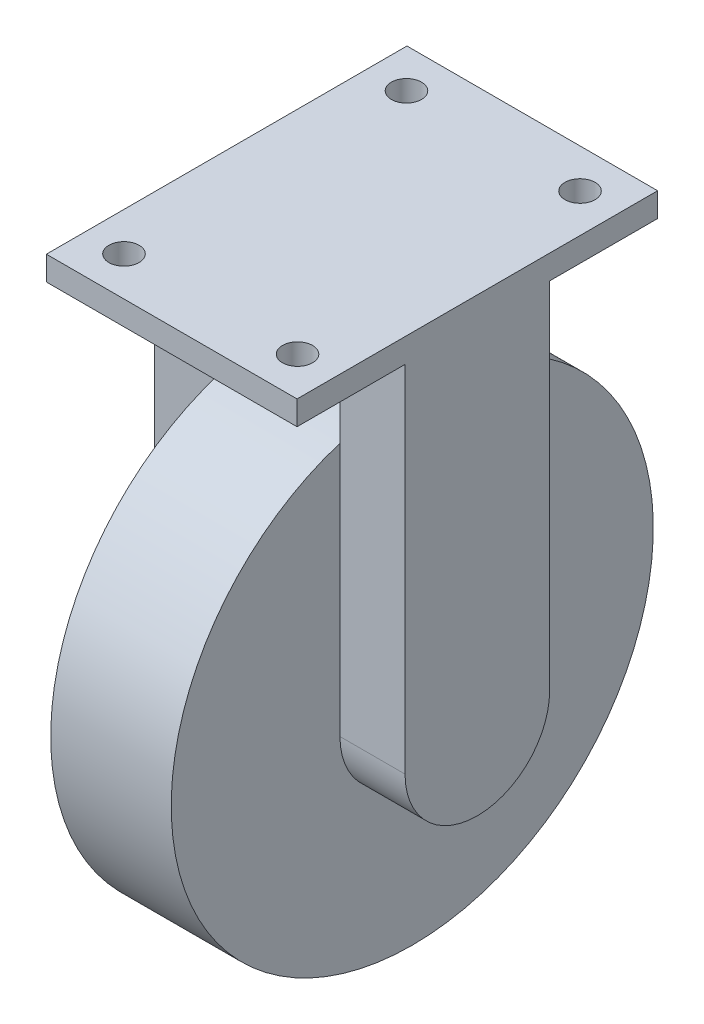
ISO-10303-21;
HEADER;
FILE_DESCRIPTION(('STEP AP214'),'2;1');
FILE_NAME('part.step','',(''),(''),'','','');
FILE_SCHEMA(('AUTOMOTIVE_DESIGN { 1 0 10303 214 1 1 1 1 }'));
ENDSEC;
DATA;
#1=APPLICATION_CONTEXT('core data for automotive mechanical design processes');
#2=APPLICATION_PROTOCOL_DEFINITION('international standard','automotive_design',2000,#1);
#3=PRODUCT_CONTEXT('',#1,'mechanical');
#4=PRODUCT('Part','Part','',(#3));
#5=PRODUCT_RELATED_PRODUCT_CATEGORY('part','',(#4));
#6=PRODUCT_DEFINITION_FORMATION('','',#4);
#7=PRODUCT_DEFINITION_CONTEXT('part definition',#1,'design');
#8=PRODUCT_DEFINITION('design','',#6,#7);
#9=PRODUCT_DEFINITION_SHAPE('','',#8);
#10=(LENGTH_UNIT() NAMED_UNIT(*) SI_UNIT(.MILLI.,.METRE.));
#11=(NAMED_UNIT(*) PLANE_ANGLE_UNIT() SI_UNIT($,.RADIAN.));
#12=(NAMED_UNIT(*) SI_UNIT($,.STERADIAN.) SOLID_ANGLE_UNIT());
#13=UNCERTAINTY_MEASURE_WITH_UNIT(LENGTH_MEASURE(1.E-05),#10,'distance_accuracy_value','');
#14=(GEOMETRIC_REPRESENTATION_CONTEXT(3) GLOBAL_UNCERTAINTY_ASSIGNED_CONTEXT((#13)) GLOBAL_UNIT_ASSIGNED_CONTEXT((#10,
#11,#12)) REPRESENTATION_CONTEXT('',''));
#15=CARTESIAN_POINT('',(0.,0.,0.));
#16=DIRECTION('',(0.,0.,1.));
#17=DIRECTION('',(1.,0.,0.));
#18=AXIS2_PLACEMENT_3D('',#15,#16,#17);
#19=CARTESIAN_POINT('',(0.,87.122,0.));
#20=DIRECTION('',(0.,1.,0.));
#21=DIRECTION('',(0.,0.,1.));
#22=AXIS2_PLACEMENT_3D('',#19,#20,#21);
#23=PLANE('',#22);
#24=CARTESIAN_POINT('',(-22.86,87.122,-37.211));
#25=DIRECTION('',(0.,1.,0.));
#26=DIRECTION('',(0.,0.,1.));
#27=AXIS2_PLACEMENT_3D('',#24,#25,#26);
#28=CIRCLE('',#27,3.96875);
#29=CARTESIAN_POINT('',(-22.86,87.122,-33.24225));
#30=VERTEX_POINT('',#29);
#31=EDGE_CURVE('E205',#30,#30,#28,.T.);
#32=ORIENTED_EDGE('',*,*,#31,.T.);
#33=EDGE_LOOP('',(#32));
#34=FACE_BOUND('',#33,.T.);
#35=CARTESIAN_POINT('',(22.86,87.122,-37.211));
#36=DIRECTION('',(0.,1.,0.));
#37=DIRECTION('',(0.,0.,1.));
#38=AXIS2_PLACEMENT_3D('',#35,#36,#37);
#39=CIRCLE('',#38,3.96875);
#40=CARTESIAN_POINT('',(22.86,87.122,-33.24225));
#41=VERTEX_POINT('',#40);
#42=EDGE_CURVE('E199',#41,#41,#39,.T.);
#43=ORIENTED_EDGE('',*,*,#42,.T.);
#44=EDGE_LOOP('',(#43));
#45=FACE_BOUND('',#44,.T.);
#46=CARTESIAN_POINT('',(22.86,87.122,37.211));
#47=DIRECTION('',(0.,1.,0.));
#48=DIRECTION('',(0.,0.,1.));
#49=AXIS2_PLACEMENT_3D('',#46,#47,#48);
#50=CIRCLE('',#49,3.96875);
#51=CARTESIAN_POINT('',(22.86,87.122,41.17975));
#52=VERTEX_POINT('',#51);
#53=EDGE_CURVE('E193',#52,#52,#50,.T.);
#54=ORIENTED_EDGE('',*,*,#53,.T.);
#55=EDGE_LOOP('',(#54));
#56=FACE_BOUND('',#55,.T.);
#57=CARTESIAN_POINT('',(-22.86,87.122,37.211));
#58=DIRECTION('',(0.,1.,0.));
#59=DIRECTION('',(0.,0.,1.));
#60=AXIS2_PLACEMENT_3D('',#57,#58,#59);
#61=CIRCLE('',#60,3.96875);
#62=CARTESIAN_POINT('',(-22.86,87.122,41.17975));
#63=VERTEX_POINT('',#62);
#64=EDGE_CURVE('E187',#63,#63,#61,.T.);
#65=ORIENTED_EDGE('',*,*,#64,.T.);
#66=EDGE_LOOP('',(#65));
#67=FACE_BOUND('',#66,.T.);
#68=DIRECTION('',(1.,0.,0.));
#69=VECTOR('',#68,1.);
#70=CARTESIAN_POINT('',(15.875,87.122,-19.05));
#71=LINE('',#70,#69);
#72=CARTESIAN_POINT('',(15.875,87.122,-19.05));
#73=VERTEX_POINT('',#72);
#74=CARTESIAN_POINT('',(33.02,87.122,-19.05));
#75=VERTEX_POINT('',#74);
#76=EDGE_CURVE('E162',#73,#75,#71,.T.);
#77=ORIENTED_EDGE('',*,*,#76,.F.);
#78=DIRECTION('',(0.,0.,-1.));
#79=VECTOR('',#78,1.);
#80=CARTESIAN_POINT('',(15.875,87.122,19.05));
#81=LINE('',#80,#79);
#82=CARTESIAN_POINT('',(15.875,87.122,19.05));
#83=VERTEX_POINT('',#82);
#84=EDGE_CURVE('E154',#83,#73,#81,.T.);
#85=ORIENTED_EDGE('',*,*,#84,.F.);
#86=DIRECTION('',(-1.,0.,0.));
#87=VECTOR('',#86,1.);
#88=CARTESIAN_POINT('',(15.875,87.122,19.05));
#89=LINE('',#88,#87);
#90=CARTESIAN_POINT('',(33.02,87.122,19.05));
#91=VERTEX_POINT('',#90);
#92=EDGE_CURVE('E158',#91,#83,#89,.T.);
#93=ORIENTED_EDGE('',*,*,#92,.F.);
#94=DIRECTION('',(0.,0.,-1.));
#95=VECTOR('',#94,1.);
#96=CARTESIAN_POINT('',(33.02,87.122,47.498));
#97=LINE('',#96,#95);
#98=CARTESIAN_POINT('',(33.02,87.122,47.498));
#99=VERTEX_POINT('',#98);
#100=EDGE_CURVE('E219',#99,#91,#97,.T.);
#101=ORIENTED_EDGE('',*,*,#100,.F.);
#102=DIRECTION('',(1.,0.,0.));
#103=VECTOR('',#102,1.);
#104=CARTESIAN_POINT('',(33.02,87.122,47.498));
#105=LINE('',#104,#103);
#106=CARTESIAN_POINT('',(-33.02,87.122,47.498));
#107=VERTEX_POINT('',#106);
#108=EDGE_CURVE('E214',#107,#99,#105,.T.);
#109=ORIENTED_EDGE('',*,*,#108,.F.);
#110=DIRECTION('',(0.,0.,1.));
#111=VECTOR('',#110,1.);
#112=CARTESIAN_POINT('',(-33.02,87.122,47.498));
#113=LINE('',#112,#111);
#114=CARTESIAN_POINT('',(-33.02,87.122,19.05));
#115=VERTEX_POINT('',#114);
#116=EDGE_CURVE('E215',#115,#107,#113,.T.);
#117=ORIENTED_EDGE('',*,*,#116,.F.);
#118=DIRECTION('',(-1.,0.,0.));
#119=VECTOR('',#118,1.);
#120=CARTESIAN_POINT('',(-33.02,87.122,19.05));
#121=LINE('',#120,#119);
#122=CARTESIAN_POINT('',(-15.875,87.122,19.05));
#123=VERTEX_POINT('',#122);
#124=EDGE_CURVE('E249',#123,#115,#121,.T.);
#125=ORIENTED_EDGE('',*,*,#124,.F.);
#126=DIRECTION('',(0.,0.,1.));
#127=VECTOR('',#126,1.);
#128=CARTESIAN_POINT('',(-15.875,87.122,19.05));
#129=LINE('',#128,#127);
#130=CARTESIAN_POINT('',(-15.875,87.122,-19.05));
#131=VERTEX_POINT('',#130);
#132=EDGE_CURVE('E246',#131,#123,#129,.T.);
#133=ORIENTED_EDGE('',*,*,#132,.F.);
#134=DIRECTION('',(1.,0.,0.));
#135=VECTOR('',#134,1.);
#136=CARTESIAN_POINT('',(-33.02,87.122,-19.05));
#137=LINE('',#136,#135);
#138=CARTESIAN_POINT('',(-33.02,87.122,-19.05));
#139=VERTEX_POINT('',#138);
#140=EDGE_CURVE('E238',#139,#131,#137,.T.);
#141=ORIENTED_EDGE('',*,*,#140,.F.);
#142=CARTESIAN_POINT('',(-33.02,87.122,-47.498));
#143=VERTEX_POINT('',#142);
#144=EDGE_CURVE('E211',#143,#139,#113,.T.);
#145=ORIENTED_EDGE('',*,*,#144,.F.);
#146=DIRECTION('',(-1.,0.,0.));
#147=VECTOR('',#146,1.);
#148=CARTESIAN_POINT('',(33.02,87.122,-47.498));
#149=LINE('',#148,#147);
#150=CARTESIAN_POINT('',(33.02,87.122,-47.498));
#151=VERTEX_POINT('',#150);
#152=EDGE_CURVE('E221',#151,#143,#149,.T.);
#153=ORIENTED_EDGE('',*,*,#152,.F.);
#154=EDGE_CURVE('E218',#75,#151,#97,.T.);
#155=ORIENTED_EDGE('',*,*,#154,.F.);
#156=EDGE_LOOP('',(#77,#85,#93,#101,#109,#117,#125,#133,#141,#145,#153,#155));
#157=FACE_BOUND('',#156,.T.);
#158=ADVANCED_FACE('F39',(#34,#45,#56,#67,#157),#23,.F.);
#159=CARTESIAN_POINT('',(-15.875,0.,0.));
#160=DIRECTION('',(1.,0.,0.));
#161=DIRECTION('',(0.,0.,-1.));
#162=AXIS2_PLACEMENT_3D('',#159,#160,#161);
#163=PLANE('',#162);
#164=DIRECTION('',(0.,1.,0.));
#165=VECTOR('',#164,1.);
#166=CARTESIAN_POINT('',(-15.875,-25.4,19.05));
#167=LINE('',#166,#165);
#168=CARTESIAN_POINT('',(-15.875,-6.34999999999998,19.05));
#169=VERTEX_POINT('',#168);
#170=CARTESIAN_POINT('',(-15.875,60.5751392899761,19.05));
#171=VERTEX_POINT('',#170);
#172=EDGE_CURVE('E255',#169,#171,#167,.T.);
#173=ORIENTED_EDGE('',*,*,#172,.F.);
#174=CARTESIAN_POINT('',(-15.875,-6.34999999999998,0.));
#175=DIRECTION('',(1.,0.,0.));
#176=DIRECTION('',(0.,0.,-1.));
#177=AXIS2_PLACEMENT_3D('',#174,#175,#176);
#178=CIRCLE('',#177,19.05);
#179=CARTESIAN_POINT('',(-15.875,-25.4,0.));
#180=VERTEX_POINT('',#179);
#181=EDGE_CURVE('E62',#169,#180,#178,.T.);
#182=ORIENTED_EDGE('',*,*,#181,.T.);
#183=CARTESIAN_POINT('',(-15.875,-6.34999999999998,0.));
#184=DIRECTION('',(1.,0.,0.));
#185=DIRECTION('',(0.,0.,-1.));
#186=AXIS2_PLACEMENT_3D('',#183,#184,#185);
#187=CIRCLE('',#186,19.05);
#188=CARTESIAN_POINT('',(-15.875,-6.34999999999998,-19.05));
#189=VERTEX_POINT('',#188);
#190=EDGE_CURVE('E285',#180,#189,#187,.T.);
#191=ORIENTED_EDGE('',*,*,#190,.T.);
#192=DIRECTION('',(0.,1.,0.));
#193=VECTOR('',#192,1.);
#194=CARTESIAN_POINT('',(-15.875,-25.4,-19.05));
#195=LINE('',#194,#193);
#196=CARTESIAN_POINT('',(-15.875,60.5751392899761,-19.05));
#197=VERTEX_POINT('',#196);
#198=EDGE_CURVE('E258',#189,#197,#195,.T.);
#199=ORIENTED_EDGE('',*,*,#198,.T.);
#200=CARTESIAN_POINT('',(-15.875,0.,0.));
#201=DIRECTION('',(1.,0.,0.));
#202=DIRECTION('',(0.,0.,-1.));
#203=AXIS2_PLACEMENT_3D('',#200,#201,#202);
#204=CIRCLE('',#203,63.5);
#205=EDGE_CURVE('E262',#171,#197,#204,.T.);
#206=ORIENTED_EDGE('',*,*,#205,.F.);
#207=EDGE_LOOP('',(#173,#182,#191,#199,#206));
#208=FACE_BOUND('',#207,.T.);
#209=ADVANCED_FACE('F316',(#208),#163,.F.);
#210=CARTESIAN_POINT('',(15.875,0.,0.));
#211=DIRECTION('',(-1.,0.,0.));
#212=DIRECTION('',(0.,0.,1.));
#213=AXIS2_PLACEMENT_3D('',#210,#211,#212);
#214=CYLINDRICAL_SURFACE('',#213,63.5);
#215=CARTESIAN_POINT('',(15.875,0.,0.));
#216=DIRECTION('',(1.,0.,0.));
#217=DIRECTION('',(0.,0.,-1.));
#218=AXIS2_PLACEMENT_3D('',#215,#216,#217);
#219=CIRCLE('',#218,63.5);
#220=CARTESIAN_POINT('',(15.875,60.5751392899761,-19.05));
#221=VERTEX_POINT('',#220);
#222=CARTESIAN_POINT('',(15.875,60.5751392899761,19.05));
#223=VERTEX_POINT('',#222);
#224=EDGE_CURVE('E173',#221,#223,#219,.T.);
#225=ORIENTED_EDGE('',*,*,#224,.F.);
#226=EDGE_CURVE('E265',#223,#221,#219,.T.);
#227=ORIENTED_EDGE('',*,*,#226,.F.);
#228=EDGE_LOOP('',(#225,#227));
#229=FACE_BOUND('',#228,.T.);
#230=EDGE_CURVE('E266',#197,#171,#204,.T.);
#231=ORIENTED_EDGE('',*,*,#230,.T.);
#232=ORIENTED_EDGE('',*,*,#205,.T.);
#233=EDGE_LOOP('',(#231,#232));
#234=FACE_BOUND('',#233,.T.);
#235=ADVANCED_FACE('F313',(#229,#234),#214,.T.);
#236=CARTESIAN_POINT('',(15.875,0.,0.));
#237=DIRECTION('',(1.,0.,0.));
#238=DIRECTION('',(0.,0.,-1.));
#239=AXIS2_PLACEMENT_3D('',#236,#237,#238);
#240=PLANE('',#239);
#241=DIRECTION('',(0.,1.,0.));
#242=VECTOR('',#241,1.);
#243=CARTESIAN_POINT('',(15.875,-25.4,-19.05));
#244=LINE('',#243,#242);
#245=CARTESIAN_POINT('',(15.875,-6.34999999999998,-19.05));
#246=VERTEX_POINT('',#245);
#247=EDGE_CURVE('E293',#246,#221,#244,.T.);
#248=ORIENTED_EDGE('',*,*,#247,.F.);
#249=CARTESIAN_POINT('',(15.875,-6.34999999999998,0.));
#250=DIRECTION('',(1.,0.,0.));
#251=DIRECTION('',(0.,0.,-1.));
#252=AXIS2_PLACEMENT_3D('',#249,#250,#251);
#253=CIRCLE('',#252,19.05);
#254=CARTESIAN_POINT('',(15.875,-25.4,0.));
#255=VERTEX_POINT('',#254);
#256=EDGE_CURVE('E11',#246,#255,#253,.F.);
#257=ORIENTED_EDGE('',*,*,#256,.T.);
#258=CARTESIAN_POINT('',(15.875,-6.34999999999998,0.));
#259=DIRECTION('',(1.,0.,0.));
#260=DIRECTION('',(0.,0.,-1.));
#261=AXIS2_PLACEMENT_3D('',#258,#259,#260);
#262=CIRCLE('',#261,19.05);
#263=CARTESIAN_POINT('',(15.875,-6.34999999999998,19.05));
#264=VERTEX_POINT('',#263);
#265=EDGE_CURVE('E48',#255,#264,#262,.F.);
#266=ORIENTED_EDGE('',*,*,#265,.T.);
#267=DIRECTION('',(0.,1.,0.));
#268=VECTOR('',#267,1.);
#269=CARTESIAN_POINT('',(15.875,-25.4,19.05));
#270=LINE('',#269,#268);
#271=EDGE_CURVE('E177',#264,#223,#270,.T.);
#272=ORIENTED_EDGE('',*,*,#271,.T.);
#273=ORIENTED_EDGE('',*,*,#226,.T.);
#274=EDGE_LOOP('',(#248,#257,#266,#272,#273));
#275=FACE_BOUND('',#274,.T.);
#276=ADVANCED_FACE('F311',(#275),#240,.T.);
#277=CARTESIAN_POINT('',(-33.02,-25.4,19.05));
#278=DIRECTION('',(1.,0.,0.));
#279=DIRECTION('',(0.,0.,-1.));
#280=AXIS2_PLACEMENT_3D('',#277,#278,#279);
#281=PLANE('',#280);
#282=DIRECTION('',(0.,1.,0.));
#283=VECTOR('',#282,1.);
#284=CARTESIAN_POINT('',(-33.02,-25.4,-19.05));
#285=LINE('',#284,#283);
#286=CARTESIAN_POINT('',(-33.02,-6.34999999999998,-19.05));
#287=VERTEX_POINT('',#286);
#288=EDGE_CURVE('E260',#287,#139,#285,.T.);
#289=ORIENTED_EDGE('',*,*,#288,.F.);
#290=CARTESIAN_POINT('',(-33.02,-6.34999999999998,0.));
#291=DIRECTION('',(1.,0.,0.));
#292=DIRECTION('',(0.,0.,-1.));
#293=AXIS2_PLACEMENT_3D('',#290,#291,#292);
#294=CIRCLE('',#293,19.05);
#295=CARTESIAN_POINT('',(-33.02,-25.4,0.));
#296=VERTEX_POINT('',#295);
#297=EDGE_CURVE('E273',#287,#296,#294,.F.);
#298=ORIENTED_EDGE('',*,*,#297,.T.);
#299=CARTESIAN_POINT('',(-33.02,-6.34999999999998,0.));
#300=DIRECTION('',(1.,0.,0.));
#301=DIRECTION('',(0.,0.,-1.));
#302=AXIS2_PLACEMENT_3D('',#299,#300,#301);
#303=CIRCLE('',#302,19.05);
#304=CARTESIAN_POINT('',(-33.02,-6.34999999999998,19.05));
#305=VERTEX_POINT('',#304);
#306=EDGE_CURVE('E271',#296,#305,#303,.F.);
#307=ORIENTED_EDGE('',*,*,#306,.T.);
#308=DIRECTION('',(0.,1.,0.));
#309=VECTOR('',#308,1.);
#310=CARTESIAN_POINT('',(-33.02,-25.4,19.05));
#311=LINE('',#310,#309);
#312=EDGE_CURVE('E252',#305,#115,#311,.T.);
#313=ORIENTED_EDGE('',*,*,#312,.T.);
#314=ORIENTED_EDGE('',*,*,#116,.T.);
#315=DIRECTION('',(0.,1.,0.));
#316=VECTOR('',#315,1.);
#317=CARTESIAN_POINT('',(-33.02,87.122,47.498));
#318=LINE('',#317,#316);
#319=CARTESIAN_POINT('',(-33.02,93.472,47.498));
#320=VERTEX_POINT('',#319);
#321=EDGE_CURVE('E224',#107,#320,#318,.T.);
#322=ORIENTED_EDGE('',*,*,#321,.T.);
#323=DIRECTION('',(0.,0.,1.));
#324=VECTOR('',#323,1.);
#325=CARTESIAN_POINT('',(-33.02,93.472,47.498));
#326=LINE('',#325,#324);
#327=CARTESIAN_POINT('',(-33.02,93.472,-47.498));
#328=VERTEX_POINT('',#327);
#329=EDGE_CURVE('E208',#328,#320,#326,.T.);
#330=ORIENTED_EDGE('',*,*,#329,.F.);
#331=DIRECTION('',(0.,1.,0.));
#332=VECTOR('',#331,1.);
#333=CARTESIAN_POINT('',(-33.02,87.122,-47.498));
#334=LINE('',#333,#332);
#335=EDGE_CURVE('E236',#143,#328,#334,.T.);
#336=ORIENTED_EDGE('',*,*,#335,.F.);
#337=ORIENTED_EDGE('',*,*,#144,.T.);
#338=EDGE_LOOP('',(#289,#298,#307,#313,#314,#322,#330,#336,#337));
#339=FACE_BOUND('',#338,.T.);
#340=ADVANCED_FACE('F337',(#339),#281,.F.);
#341=CARTESIAN_POINT('',(-33.02,-25.4,-19.05));
#342=DIRECTION('',(0.,0.,1.));
#343=DIRECTION('',(1.,0.,0.));
#344=AXIS2_PLACEMENT_3D('',#341,#342,#343);
#345=PLANE('',#344);
#346=ORIENTED_EDGE('',*,*,#198,.F.);
#347=DIRECTION('',(1.,0.,0.));
#348=VECTOR('',#347,1.);
#349=CARTESIAN_POINT('',(-33.02,-6.34999999999998,-19.05));
#350=LINE('',#349,#348);
#351=EDGE_CURVE('E264',#189,#287,#350,.F.);
#352=ORIENTED_EDGE('',*,*,#351,.T.);
#353=ORIENTED_EDGE('',*,*,#288,.T.);
#354=ORIENTED_EDGE('',*,*,#140,.T.);
#355=EDGE_CURVE('E257',#197,#131,#195,.T.);
#356=ORIENTED_EDGE('',*,*,#355,.F.);
#357=EDGE_LOOP('',(#346,#352,#353,#354,#356));
#358=FACE_BOUND('',#357,.T.);
#359=ADVANCED_FACE('F331',(#358),#345,.F.);
#360=CARTESIAN_POINT('',(-15.875,-25.4,19.05));
#361=DIRECTION('',(-1.,0.,0.));
#362=DIRECTION('',(0.,0.,1.));
#363=AXIS2_PLACEMENT_3D('',#360,#361,#362);
#364=PLANE('',#363);
#365=ORIENTED_EDGE('',*,*,#230,.F.);
#366=ORIENTED_EDGE('',*,*,#355,.T.);
#367=ORIENTED_EDGE('',*,*,#132,.T.);
#368=EDGE_CURVE('E254',#171,#123,#167,.T.);
#369=ORIENTED_EDGE('',*,*,#368,.F.);
#370=EDGE_LOOP('',(#365,#366,#367,#369));
#371=FACE_BOUND('',#370,.T.);
#372=ADVANCED_FACE('F324',(#371),#364,.F.);
#373=CARTESIAN_POINT('',(-33.02,-25.4,19.05));
#374=DIRECTION('',(0.,0.,-1.));
#375=DIRECTION('',(-1.,0.,0.));
#376=AXIS2_PLACEMENT_3D('',#373,#374,#375);
#377=PLANE('',#376);
#378=ORIENTED_EDGE('',*,*,#312,.F.);
#379=DIRECTION('',(-1.,0.,0.));
#380=VECTOR('',#379,1.);
#381=CARTESIAN_POINT('',(-15.875,-6.34999999999998,19.05));
#382=LINE('',#381,#380);
#383=EDGE_CURVE('E275',#305,#169,#382,.F.);
#384=ORIENTED_EDGE('',*,*,#383,.T.);
#385=ORIENTED_EDGE('',*,*,#172,.T.);
#386=ORIENTED_EDGE('',*,*,#368,.T.);
#387=ORIENTED_EDGE('',*,*,#124,.T.);
#388=EDGE_LOOP('',(#378,#384,#385,#386,#387));
#389=FACE_BOUND('',#388,.T.);
#390=ADVANCED_FACE('F353',(#389),#377,.F.);
#391=CARTESIAN_POINT('',(33.02,87.122,-47.498));
#392=DIRECTION('',(0.,0.,-1.));
#393=DIRECTION('',(-1.,0.,0.));
#394=AXIS2_PLACEMENT_3D('',#391,#392,#393);
#395=PLANE('',#394);
#396=DIRECTION('',(-1.,0.,0.));
#397=VECTOR('',#396,1.);
#398=CARTESIAN_POINT('',(33.02,93.472,-47.498));
#399=LINE('',#398,#397);
#400=CARTESIAN_POINT('',(33.02,93.472,-47.498));
#401=VERTEX_POINT('',#400);
#402=EDGE_CURVE('E233',#401,#328,#399,.T.);
#403=ORIENTED_EDGE('',*,*,#402,.F.);
#404=DIRECTION('',(0.,1.,0.));
#405=VECTOR('',#404,1.);
#406=CARTESIAN_POINT('',(33.02,87.122,-47.498));
#407=LINE('',#406,#405);
#408=EDGE_CURVE('E239',#151,#401,#407,.T.);
#409=ORIENTED_EDGE('',*,*,#408,.F.);
#410=ORIENTED_EDGE('',*,*,#152,.T.);
#411=ORIENTED_EDGE('',*,*,#335,.T.);
#412=EDGE_LOOP('',(#403,#409,#410,#411));
#413=FACE_BOUND('',#412,.T.);
#414=ADVANCED_FACE('F341',(#413),#395,.T.);
#415=CARTESIAN_POINT('',(33.02,87.122,47.498));
#416=DIRECTION('',(1.,0.,0.));
#417=DIRECTION('',(0.,0.,-1.));
#418=AXIS2_PLACEMENT_3D('',#415,#416,#417);
#419=PLANE('',#418);
#420=DIRECTION('',(0.,1.,0.));
#421=VECTOR('',#420,1.);
#422=CARTESIAN_POINT('',(33.02,-25.4,19.05));
#423=LINE('',#422,#421);
#424=CARTESIAN_POINT('',(33.02,-6.34999999999998,19.05));
#425=VERTEX_POINT('',#424);
#426=EDGE_CURVE('E178',#425,#91,#423,.T.);
#427=ORIENTED_EDGE('',*,*,#426,.F.);
#428=CARTESIAN_POINT('',(33.02,-6.34999999999998,0.));
#429=DIRECTION('',(1.,0.,0.));
#430=DIRECTION('',(0.,0.,-1.));
#431=AXIS2_PLACEMENT_3D('',#428,#429,#430);
#432=CIRCLE('',#431,19.05);
#433=CARTESIAN_POINT('',(33.02,-25.4,0.));
#434=VERTEX_POINT('',#433);
#435=EDGE_CURVE('E281',#425,#434,#432,.T.);
#436=ORIENTED_EDGE('',*,*,#435,.T.);
#437=CARTESIAN_POINT('',(33.02,-6.34999999999998,0.));
#438=DIRECTION('',(1.,0.,0.));
#439=DIRECTION('',(0.,0.,-1.));
#440=AXIS2_PLACEMENT_3D('',#437,#438,#439);
#441=CIRCLE('',#440,19.05);
#442=CARTESIAN_POINT('',(33.02,-6.34999999999998,-19.05));
#443=VERTEX_POINT('',#442);
#444=EDGE_CURVE('E279',#434,#443,#441,.T.);
#445=ORIENTED_EDGE('',*,*,#444,.T.);
#446=DIRECTION('',(0.,1.,0.));
#447=VECTOR('',#446,1.);
#448=CARTESIAN_POINT('',(33.02,-25.4,-19.05));
#449=LINE('',#448,#447);
#450=EDGE_CURVE('E306',#443,#75,#449,.T.);
#451=ORIENTED_EDGE('',*,*,#450,.T.);
#452=ORIENTED_EDGE('',*,*,#154,.T.);
#453=ORIENTED_EDGE('',*,*,#408,.T.);
#454=DIRECTION('',(0.,0.,-1.));
#455=VECTOR('',#454,1.);
#456=CARTESIAN_POINT('',(33.02,93.472,47.498));
#457=LINE('',#456,#455);
#458=CARTESIAN_POINT('',(33.02,93.472,47.498));
#459=VERTEX_POINT('',#458);
#460=EDGE_CURVE('E230',#459,#401,#457,.T.);
#461=ORIENTED_EDGE('',*,*,#460,.F.);
#462=DIRECTION('',(0.,1.,0.));
#463=VECTOR('',#462,1.);
#464=CARTESIAN_POINT('',(33.02,87.122,47.498));
#465=LINE('',#464,#463);
#466=EDGE_CURVE('E241',#99,#459,#465,.T.);
#467=ORIENTED_EDGE('',*,*,#466,.F.);
#468=ORIENTED_EDGE('',*,*,#100,.T.);
#469=EDGE_LOOP('',(#427,#436,#445,#451,#452,#453,#461,#467,#468));
#470=FACE_BOUND('',#469,.T.);
#471=ADVANCED_FACE('F305',(#470),#419,.T.);
#472=CARTESIAN_POINT('',(33.02,87.122,47.498));
#473=DIRECTION('',(0.,0.,1.));
#474=DIRECTION('',(1.,0.,0.));
#475=AXIS2_PLACEMENT_3D('',#472,#473,#474);
#476=PLANE('',#475);
#477=DIRECTION('',(1.,0.,0.));
#478=VECTOR('',#477,1.);
#479=CARTESIAN_POINT('',(33.02,93.472,47.498));
#480=LINE('',#479,#478);
#481=EDGE_CURVE('E227',#320,#459,#480,.T.);
#482=ORIENTED_EDGE('',*,*,#481,.F.);
#483=ORIENTED_EDGE('',*,*,#321,.F.);
#484=ORIENTED_EDGE('',*,*,#108,.T.);
#485=ORIENTED_EDGE('',*,*,#466,.T.);
#486=EDGE_LOOP('',(#482,#483,#484,#485));
#487=FACE_BOUND('',#486,.T.);
#488=ADVANCED_FACE('F349',(#487),#476,.T.);
#489=CARTESIAN_POINT('',(0.,93.472,0.));
#490=DIRECTION('',(0.,1.,0.));
#491=DIRECTION('',(0.,0.,1.));
#492=AXIS2_PLACEMENT_3D('',#489,#490,#491);
#493=PLANE('',#492);
#494=CARTESIAN_POINT('',(-22.86,93.472,37.211));
#495=DIRECTION('',(0.,1.,0.));
#496=DIRECTION('',(0.,0.,1.));
#497=AXIS2_PLACEMENT_3D('',#494,#495,#496);
#498=CIRCLE('',#497,3.96875);
#499=CARTESIAN_POINT('',(-22.86,93.472,41.17975));
#500=VERTEX_POINT('',#499);
#501=EDGE_CURVE('E166',#500,#500,#498,.T.);
#502=ORIENTED_EDGE('',*,*,#501,.F.);
#503=EDGE_LOOP('',(#502));
#504=FACE_BOUND('',#503,.T.);
#505=CARTESIAN_POINT('',(22.86,93.472,37.211));
#506=DIRECTION('',(0.,1.,0.));
#507=DIRECTION('',(0.,0.,1.));
#508=AXIS2_PLACEMENT_3D('',#505,#506,#507);
#509=CIRCLE('',#508,3.96875);
#510=CARTESIAN_POINT('',(22.86,93.472,41.17975));
#511=VERTEX_POINT('',#510);
#512=EDGE_CURVE('E190',#511,#511,#509,.T.);
#513=ORIENTED_EDGE('',*,*,#512,.F.);
#514=EDGE_LOOP('',(#513));
#515=FACE_BOUND('',#514,.T.);
#516=CARTESIAN_POINT('',(22.86,93.472,-37.211));
#517=DIRECTION('',(0.,1.,0.));
#518=DIRECTION('',(0.,0.,1.));
#519=AXIS2_PLACEMENT_3D('',#516,#517,#518);
#520=CIRCLE('',#519,3.96875);
#521=CARTESIAN_POINT('',(22.86,93.472,-33.24225));
#522=VERTEX_POINT('',#521);
#523=EDGE_CURVE('E196',#522,#522,#520,.T.);
#524=ORIENTED_EDGE('',*,*,#523,.F.);
#525=EDGE_LOOP('',(#524));
#526=FACE_BOUND('',#525,.T.);
#527=CARTESIAN_POINT('',(-22.86,93.472,-37.211));
#528=DIRECTION('',(0.,1.,0.));
#529=DIRECTION('',(0.,0.,1.));
#530=AXIS2_PLACEMENT_3D('',#527,#528,#529);
#531=CIRCLE('',#530,3.96875);
#532=CARTESIAN_POINT('',(-22.86,93.472,-33.24225));
#533=VERTEX_POINT('',#532);
#534=EDGE_CURVE('E202',#533,#533,#531,.T.);
#535=ORIENTED_EDGE('',*,*,#534,.F.);
#536=EDGE_LOOP('',(#535));
#537=FACE_BOUND('',#536,.T.);
#538=ORIENTED_EDGE('',*,*,#329,.T.);
#539=ORIENTED_EDGE('',*,*,#481,.T.);
#540=ORIENTED_EDGE('',*,*,#460,.T.);
#541=ORIENTED_EDGE('',*,*,#402,.T.);
#542=EDGE_LOOP('',(#538,#539,#540,#541));
#543=FACE_BOUND('',#542,.T.);
#544=ADVANCED_FACE('F345',(#504,#515,#526,#537,#543),#493,.T.);
#545=CARTESIAN_POINT('',(-22.86,87.122,-37.211));
#546=DIRECTION('',(0.,1.,0.));
#547=DIRECTION('',(0.,0.,1.));
#548=AXIS2_PLACEMENT_3D('',#545,#546,#547);
#549=CYLINDRICAL_SURFACE('',#548,3.96875);
#550=ORIENTED_EDGE('',*,*,#31,.F.);
#551=EDGE_LOOP('',(#550));
#552=FACE_BOUND('',#551,.T.);
#553=ORIENTED_EDGE('',*,*,#534,.T.);
#554=EDGE_LOOP('',(#553));
#555=FACE_BOUND('',#554,.T.);
#556=ADVANCED_FACE('F376',(#552,#555),#549,.F.);
#557=CARTESIAN_POINT('',(22.86,87.122,-37.211));
#558=DIRECTION('',(0.,1.,0.));
#559=DIRECTION('',(0.,0.,1.));
#560=AXIS2_PLACEMENT_3D('',#557,#558,#559);
#561=CYLINDRICAL_SURFACE('',#560,3.96875);
#562=ORIENTED_EDGE('',*,*,#42,.F.);
#563=EDGE_LOOP('',(#562));
#564=FACE_BOUND('',#563,.T.);
#565=ORIENTED_EDGE('',*,*,#523,.T.);
#566=EDGE_LOOP('',(#565));
#567=FACE_BOUND('',#566,.T.);
#568=ADVANCED_FACE('F441',(#564,#567),#561,.F.);
#569=CARTESIAN_POINT('',(22.86,87.122,37.211));
#570=DIRECTION('',(0.,1.,0.));
#571=DIRECTION('',(0.,0.,1.));
#572=AXIS2_PLACEMENT_3D('',#569,#570,#571);
#573=CYLINDRICAL_SURFACE('',#572,3.96875);
#574=ORIENTED_EDGE('',*,*,#53,.F.);
#575=EDGE_LOOP('',(#574));
#576=FACE_BOUND('',#575,.T.);
#577=ORIENTED_EDGE('',*,*,#512,.T.);
#578=EDGE_LOOP('',(#577));
#579=FACE_BOUND('',#578,.T.);
#580=ADVANCED_FACE('F448',(#576,#579),#573,.F.);
#581=CARTESIAN_POINT('',(-22.86,87.122,37.211));
#582=DIRECTION('',(0.,1.,0.));
#583=DIRECTION('',(0.,0.,1.));
#584=AXIS2_PLACEMENT_3D('',#581,#582,#583);
#585=CYLINDRICAL_SURFACE('',#584,3.96875);
#586=ORIENTED_EDGE('',*,*,#64,.F.);
#587=EDGE_LOOP('',(#586));
#588=FACE_BOUND('',#587,.T.);
#589=ORIENTED_EDGE('',*,*,#501,.T.);
#590=EDGE_LOOP('',(#589));
#591=FACE_BOUND('',#590,.T.);
#592=ADVANCED_FACE('F455',(#588,#591),#585,.F.);
#593=CARTESIAN_POINT('',(15.875,-25.4,19.05));
#594=DIRECTION('',(1.,0.,0.));
#595=DIRECTION('',(0.,0.,-1.));
#596=AXIS2_PLACEMENT_3D('',#593,#594,#595);
#597=PLANE('',#596);
#598=EDGE_CURVE('E290',#221,#73,#244,.T.);
#599=ORIENTED_EDGE('',*,*,#598,.F.);
#600=ORIENTED_EDGE('',*,*,#224,.T.);
#601=EDGE_CURVE('E170',#223,#83,#270,.T.);
#602=ORIENTED_EDGE('',*,*,#601,.T.);
#603=ORIENTED_EDGE('',*,*,#84,.T.);
#604=EDGE_LOOP('',(#599,#600,#602,#603));
#605=FACE_BOUND('',#604,.T.);
#606=ADVANCED_FACE('F171',(#605),#597,.F.);
#607=CARTESIAN_POINT('',(15.875,-25.4,-19.05));
#608=DIRECTION('',(0.,0.,1.));
#609=DIRECTION('',(1.,0.,0.));
#610=AXIS2_PLACEMENT_3D('',#607,#608,#609);
#611=PLANE('',#610);
#612=ORIENTED_EDGE('',*,*,#450,.F.);
#613=DIRECTION('',(1.,0.,0.));
#614=VECTOR('',#613,1.);
#615=CARTESIAN_POINT('',(15.875,-6.34999999999998,-19.05));
#616=LINE('',#615,#614);
#617=EDGE_CURVE('E283',#443,#246,#616,.F.);
#618=ORIENTED_EDGE('',*,*,#617,.T.);
#619=ORIENTED_EDGE('',*,*,#247,.T.);
#620=ORIENTED_EDGE('',*,*,#598,.T.);
#621=ORIENTED_EDGE('',*,*,#76,.T.);
#622=EDGE_LOOP('',(#612,#618,#619,#620,#621));
#623=FACE_BOUND('',#622,.T.);
#624=ADVANCED_FACE('F308',(#623),#611,.F.);
#625=CARTESIAN_POINT('',(15.875,-25.4,19.05));
#626=DIRECTION('',(0.,0.,-1.));
#627=DIRECTION('',(-1.,0.,0.));
#628=AXIS2_PLACEMENT_3D('',#625,#626,#627);
#629=PLANE('',#628);
#630=ORIENTED_EDGE('',*,*,#271,.F.);
#631=DIRECTION('',(-1.,0.,0.));
#632=VECTOR('',#631,1.);
#633=CARTESIAN_POINT('',(33.02,-6.34999999999998,19.05));
#634=LINE('',#633,#632);
#635=EDGE_CURVE('E277',#264,#425,#634,.F.);
#636=ORIENTED_EDGE('',*,*,#635,.T.);
#637=ORIENTED_EDGE('',*,*,#426,.T.);
#638=ORIENTED_EDGE('',*,*,#92,.T.);
#639=ORIENTED_EDGE('',*,*,#601,.F.);
#640=EDGE_LOOP('',(#630,#636,#637,#638,#639));
#641=FACE_BOUND('',#640,.T.);
#642=ADVANCED_FACE('F180',(#641),#629,.F.);
#643=CARTESIAN_POINT('',(0.,-6.34999999999998,0.));
#644=DIRECTION('',(1.,0.,0.));
#645=DIRECTION('',(0.,0.,-1.));
#646=AXIS2_PLACEMENT_3D('',#643,#644,#645);
#647=CYLINDRICAL_SURFACE('',#646,19.05);
#648=ORIENTED_EDGE('',*,*,#383,.F.);
#649=ORIENTED_EDGE('',*,*,#306,.F.);
#650=DIRECTION('',(-1.,0.,0.));
#651=VECTOR('',#650,1.);
#652=CARTESIAN_POINT('',(-33.02,-25.4,0.));
#653=LINE('',#652,#651);
#654=EDGE_CURVE('E288',#180,#296,#653,.T.);
#655=ORIENTED_EDGE('',*,*,#654,.F.);
#656=ORIENTED_EDGE('',*,*,#181,.F.);
#657=EDGE_LOOP('',(#648,#649,#655,#656));
#658=FACE_BOUND('',#657,.T.);
#659=ADVANCED_FACE('F357',(#658),#647,.T.);
#660=CARTESIAN_POINT('',(0.,-6.34999999999998,0.));
#661=DIRECTION('',(-1.,0.,0.));
#662=DIRECTION('',(0.,0.,1.));
#663=AXIS2_PLACEMENT_3D('',#660,#661,#662);
#664=CYLINDRICAL_SURFACE('',#663,19.05);
#665=ORIENTED_EDGE('',*,*,#297,.F.);
#666=ORIENTED_EDGE('',*,*,#351,.F.);
#667=ORIENTED_EDGE('',*,*,#190,.F.);
#668=ORIENTED_EDGE('',*,*,#654,.T.);
#669=EDGE_LOOP('',(#665,#666,#667,#668));
#670=FACE_BOUND('',#669,.T.);
#671=ADVANCED_FACE('F358',(#670),#664,.T.);
#672=CARTESIAN_POINT('',(0.,-6.34999999999998,0.));
#673=DIRECTION('',(-1.,0.,0.));
#674=DIRECTION('',(0.,0.,1.));
#675=AXIS2_PLACEMENT_3D('',#672,#673,#674);
#676=CYLINDRICAL_SURFACE('',#675,19.05);
#677=ORIENTED_EDGE('',*,*,#617,.F.);
#678=ORIENTED_EDGE('',*,*,#444,.F.);
#679=DIRECTION('',(1.,0.,0.));
#680=VECTOR('',#679,1.);
#681=CARTESIAN_POINT('',(33.02,-25.4,0.));
#682=LINE('',#681,#680);
#683=EDGE_CURVE('E43',#255,#434,#682,.T.);
#684=ORIENTED_EDGE('',*,*,#683,.F.);
#685=ORIENTED_EDGE('',*,*,#256,.F.);
#686=EDGE_LOOP('',(#677,#678,#684,#685));
#687=FACE_BOUND('',#686,.T.);
#688=ADVANCED_FACE('F41',(#687),#676,.T.);
#689=CARTESIAN_POINT('',(0.,-6.34999999999998,0.));
#690=DIRECTION('',(1.,0.,0.));
#691=DIRECTION('',(0.,0.,-1.));
#692=AXIS2_PLACEMENT_3D('',#689,#690,#691);
#693=CYLINDRICAL_SURFACE('',#692,19.05);
#694=ORIENTED_EDGE('',*,*,#435,.F.);
#695=ORIENTED_EDGE('',*,*,#635,.F.);
#696=ORIENTED_EDGE('',*,*,#265,.F.);
#697=ORIENTED_EDGE('',*,*,#683,.T.);
#698=EDGE_LOOP('',(#694,#695,#696,#697));
#699=FACE_BOUND('',#698,.T.);
#700=ADVANCED_FACE('F298',(#699),#693,.T.);
#701=CLOSED_SHELL('',(#158,#209,#235,#276,#340,#359,#372,#390,#414,#471,#488,#544,#556,#568,
#580,#592,#606,#624,#642,#659,#671,#688,#700));
#702=MANIFOLD_SOLID_BREP('B2',#701);
#703=ADVANCED_BREP_SHAPE_REPRESENTATION('',(#18,#702),#14);
#704=SHAPE_DEFINITION_REPRESENTATION(#9,#703);
ENDSEC;
END-ISO-10303-21;
